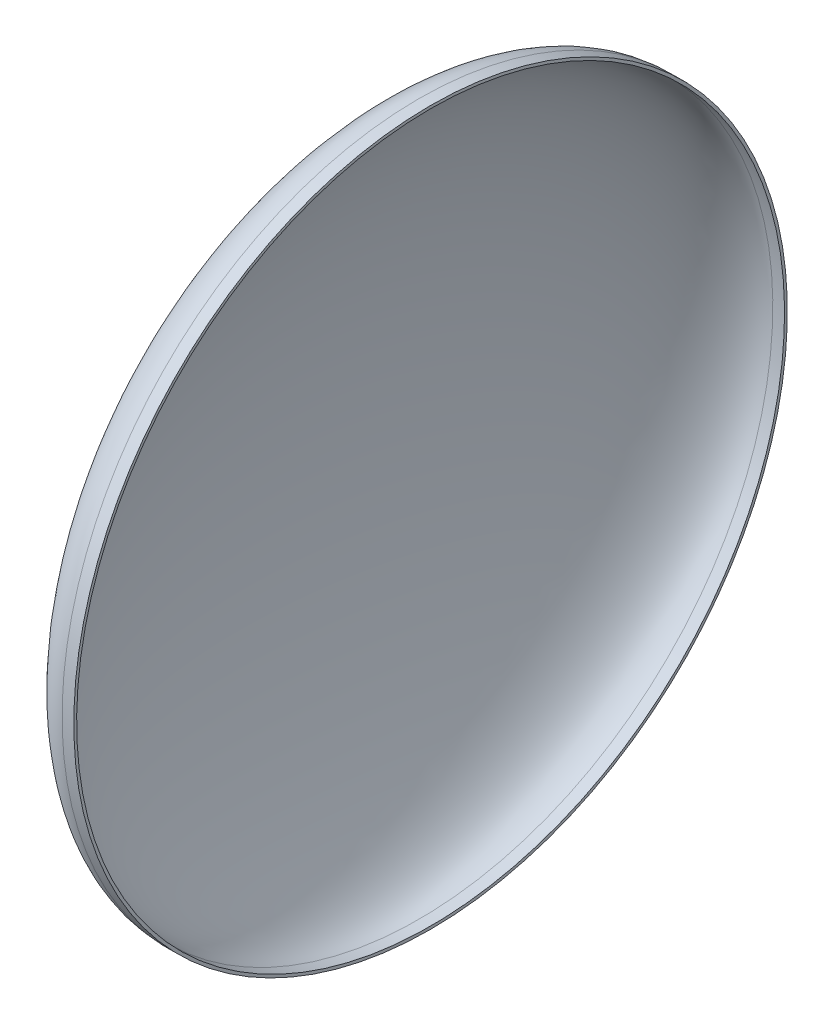
ISO-10303-21;
HEADER;
FILE_DESCRIPTION(('STEP AP214'),'2;1');
FILE_NAME('part.step','',(''),(''),'','','');
FILE_SCHEMA(('AUTOMOTIVE_DESIGN { 1 0 10303 214 1 1 1 1 }'));
ENDSEC;
DATA;
#1=APPLICATION_CONTEXT('core data for automotive mechanical design processes');
#2=APPLICATION_PROTOCOL_DEFINITION('international standard','automotive_design',2000,#1);
#3=PRODUCT_CONTEXT('',#1,'mechanical');
#4=PRODUCT('Part','Part','',(#3));
#5=PRODUCT_RELATED_PRODUCT_CATEGORY('part','',(#4));
#6=PRODUCT_DEFINITION_FORMATION('','',#4);
#7=PRODUCT_DEFINITION_CONTEXT('part definition',#1,'design');
#8=PRODUCT_DEFINITION('design','',#6,#7);
#9=PRODUCT_DEFINITION_SHAPE('','',#8);
#10=(LENGTH_UNIT() NAMED_UNIT(*) SI_UNIT(.MILLI.,.METRE.));
#11=(NAMED_UNIT(*) PLANE_ANGLE_UNIT() SI_UNIT($,.RADIAN.));
#12=(NAMED_UNIT(*) SI_UNIT($,.STERADIAN.) SOLID_ANGLE_UNIT());
#13=UNCERTAINTY_MEASURE_WITH_UNIT(LENGTH_MEASURE(1.E-05),#10,'distance_accuracy_value','');
#14=(GEOMETRIC_REPRESENTATION_CONTEXT(3) GLOBAL_UNCERTAINTY_ASSIGNED_CONTEXT((#13)) GLOBAL_UNIT_ASSIGNED_CONTEXT((#10,
#11,#12)) REPRESENTATION_CONTEXT('',''));
#15=CARTESIAN_POINT('',(0.,0.,0.));
#16=DIRECTION('',(0.,0.,1.));
#17=DIRECTION('',(1.,0.,0.));
#18=AXIS2_PLACEMENT_3D('',#15,#16,#17);
#19=CARTESIAN_POINT('',(0.,1520.,0.));
#20=DIRECTION('',(1.,0.,0.));
#21=DIRECTION('',(0.,1.,0.));
#22=AXIS2_PLACEMENT_3D('',#19,#20,#21);
#23=PLANE('',#22);
#24=CARTESIAN_POINT('',(1.86146313470398E-13,0.,0.));
#25=DIRECTION('',(1.,0.,0.));
#26=DIRECTION('',(0.,1.,0.));
#27=AXIS2_PLACEMENT_3D('',#24,#25,#26);
#28=CIRCLE('',#27,1520.);
#29=CARTESIAN_POINT('',(0.,1520.,0.));
#30=VERTEX_POINT('',#29);
#31=EDGE_CURVE('E61',#30,#30,#28,.T.);
#32=ORIENTED_EDGE('',*,*,#31,.T.);
#33=EDGE_LOOP('',(#32));
#34=FACE_BOUND('',#33,.T.);
#35=CARTESIAN_POINT('',(1.84676737311421E-13,0.,0.));
#36=DIRECTION('',(1.,0.,0.));
#37=DIRECTION('',(0.,1.,0.));
#38=AXIS2_PLACEMENT_3D('',#35,#36,#37);
#39=CIRCLE('',#38,1508.);
#40=CARTESIAN_POINT('',(0.,1508.,0.));
#41=VERTEX_POINT('',#40);
#42=EDGE_CURVE('E11',#41,#41,#39,.T.);
#43=ORIENTED_EDGE('',*,*,#42,.F.);
#44=EDGE_LOOP('',(#43));
#45=FACE_BOUND('',#44,.T.);
#46=ADVANCED_FACE('F38',(#34,#45),#23,.T.);
#47=CARTESIAN_POINT('',(0.,0.,0.));
#48=DIRECTION('',(1.,0.,0.));
#49=DIRECTION('',(0.,1.,0.));
#50=AXIS2_PLACEMENT_3D('',#47,#48,#49);
#51=CYLINDRICAL_SURFACE('',#50,1508.);
#52=ORIENTED_EDGE('',*,*,#42,.T.);
#53=EDGE_LOOP('',(#52));
#54=FACE_BOUND('',#53,.T.);
#55=CARTESIAN_POINT('',(-49.9999999999998,0.,0.));
#56=DIRECTION('',(1.,0.,0.));
#57=DIRECTION('',(0.,1.,0.));
#58=AXIS2_PLACEMENT_3D('',#55,#56,#57);
#59=CIRCLE('',#58,1508.);
#60=CARTESIAN_POINT('',(-50.,1508.,0.));
#61=VERTEX_POINT('',#60);
#62=EDGE_CURVE('E45',#61,#61,#59,.T.);
#63=ORIENTED_EDGE('',*,*,#62,.F.);
#64=EDGE_LOOP('',(#63));
#65=FACE_BOUND('',#64,.T.);
#66=ADVANCED_FACE('F77',(#54,#65),#51,.F.);
#67=CARTESIAN_POINT('',(-488.,0.,0.));
#68=CARTESIAN_POINT('',(-488.,24.8034396337484,0.));
#69=CARTESIAN_POINT('',(-487.639314381548,74.4426635136896,0.));
#70=CARTESIAN_POINT('',(-485.477222347164,173.44663385336,0.));
#71=CARTESIAN_POINT('',(-480.081803606292,296.311452025797,0.));
#72=CARTESIAN_POINT('',(-469.36125572248,440.87161706818,0.));
#73=CARTESIAN_POINT('',(-454.500683421956,581.158180706038,0.));
#74=CARTESIAN_POINT('',(-435.646081686305,715.804921581947,0.));
#75=CARTESIAN_POINT('',(-405.434365171432,886.074191627853,0.));
#76=CARTESIAN_POINT('',(-368.048388683024,1039.91800695548,0.));
#77=CARTESIAN_POINT('',(-324.631860887395,1172.81241476197,0.));
#78=CARTESIAN_POINT('',(-289.412285900357,1261.03183129719,0.));
#79=CARTESIAN_POINT('',(-251.930756830163,1336.8965026334,0.));
#80=CARTESIAN_POINT('',(-212.651682426501,1399.61868615416,0.));
#81=CARTESIAN_POINT('',(-172.131400992944,1448.54354266862,0.));
#82=CARTESIAN_POINT('',(-137.908506734637,1477.43607476374,0.));
#83=CARTESIAN_POINT('',(-110.633378238131,1493.40554364361,0.));
#84=CARTESIAN_POINT('',(-90.2958094095913,1501.86735231951,0.));
#85=CARTESIAN_POINT('',(-73.4670612133101,1506.05390928088,0.));
#86=CARTESIAN_POINT('',(-60.0482502896367,1507.72241341013,0.));
#87=CARTESIAN_POINT('',(-53.3535180620649,1508.,0.));
#88=CARTESIAN_POINT('',(-50.,1508.,0.));
#89=B_SPLINE_CURVE_WITH_KNOTS('',3,(#67,#68,#69,#70,#71,#72,#73,#74,#75,#76,#77,#78,#79,#80,#81,
#82,#83,#84,#85,#86,#87,#88),.UNSPECIFIED.,.F.,.F.,(4,1,1,1,1,1,1,1,1,1,1,1,1,1,1,1,1,1,1,4),
(0.,0.0490873852123406,0.0981747704246811,0.196349540849362,0.294524311274043,0.392699081698724,
0.490873852123405,0.589048622548086,0.785398163397448,0.883572933822129,0.98174770424681,
1.07992247467149,1.17809724509617,1.27627201552085,1.37444678594553,1.42353417115788,
1.47262155637022,1.52170894158256,1.54625263418873,1.5707963267949),.UNSPECIFIED.);
#90=CARTESIAN_POINT('',(0.,0.,0.));
#91=DIRECTION('',(1.,0.,0.));
#92=AXIS1_PLACEMENT('',#90,#91);
#93=SURFACE_OF_REVOLUTION('',#89,#92);
#94=ORIENTED_EDGE('',*,*,#62,.T.);
#95=EDGE_LOOP('',(#94));
#96=FACE_BOUND('',#95,.T.);
#97=CARTESIAN_POINT('',(-488.,0.,0.));
#98=VERTEX_POINT('',#97);
#99=VERTEX_LOOP('',#98);
#100=FACE_BOUND('',#99,.T.);
#101=ADVANCED_FACE('F55',(#96,#100),#93,.F.);
#102=CARTESIAN_POINT('',(-50.,0.,0.));
#103=DIRECTION('',(0.,0.,1.));
#104=DIRECTION('',(0.,1.,0.));
#105=AXIS2_PLACEMENT_3D('',#102,#103,#104);
#106=ELLIPSE('',#105,1520.,450.);
#107=TRIMMED_CURVE('',#106,(PARAMETER_VALUE(-1.5707963267949)),
(PARAMETER_VALUE(1.5707963267949)),.T.,.PARAMETER.);
#108=CARTESIAN_POINT('',(0.,0.,0.));
#109=DIRECTION('',(1.,0.,0.));
#110=AXIS1_PLACEMENT('',#108,#109);
#111=SURFACE_OF_REVOLUTION('',#107,#110);
#112=CARTESIAN_POINT('',(-500.,0.,0.));
#113=VERTEX_POINT('',#112);
#114=VERTEX_LOOP('',#113);
#115=FACE_BOUND('',#114,.T.);
#116=CARTESIAN_POINT('',(-49.9999999999998,0.,0.));
#117=DIRECTION('',(1.,0.,0.));
#118=DIRECTION('',(0.,1.,0.));
#119=AXIS2_PLACEMENT_3D('',#116,#117,#118);
#120=CIRCLE('',#119,1520.);
#121=CARTESIAN_POINT('',(-50.,1520.,0.));
#122=VERTEX_POINT('',#121);
#123=EDGE_CURVE('E59',#122,#122,#120,.T.);
#124=ORIENTED_EDGE('',*,*,#123,.F.);
#125=EDGE_LOOP('',(#124));
#126=FACE_BOUND('',#125,.T.);
#127=ADVANCED_FACE('F51',(#115,#126),#111,.F.);
#128=CARTESIAN_POINT('',(0.,0.,0.));
#129=DIRECTION('',(1.,0.,0.));
#130=DIRECTION('',(0.,1.,0.));
#131=AXIS2_PLACEMENT_3D('',#128,#129,#130);
#132=CYLINDRICAL_SURFACE('',#131,1520.);
#133=ORIENTED_EDGE('',*,*,#123,.T.);
#134=EDGE_LOOP('',(#133));
#135=FACE_BOUND('',#134,.T.);
#136=ORIENTED_EDGE('',*,*,#31,.F.);
#137=EDGE_LOOP('',(#136));
#138=FACE_BOUND('',#137,.T.);
#139=ADVANCED_FACE('F54',(#135,#138),#132,.T.);
#140=CLOSED_SHELL('',(#46,#66,#101,#127,#139));
#141=MANIFOLD_SOLID_BREP('B2',#140);
#142=ADVANCED_BREP_SHAPE_REPRESENTATION('',(#18,#141),#14);
#143=SHAPE_DEFINITION_REPRESENTATION(#9,#142);
ENDSEC;
END-ISO-10303-21;
